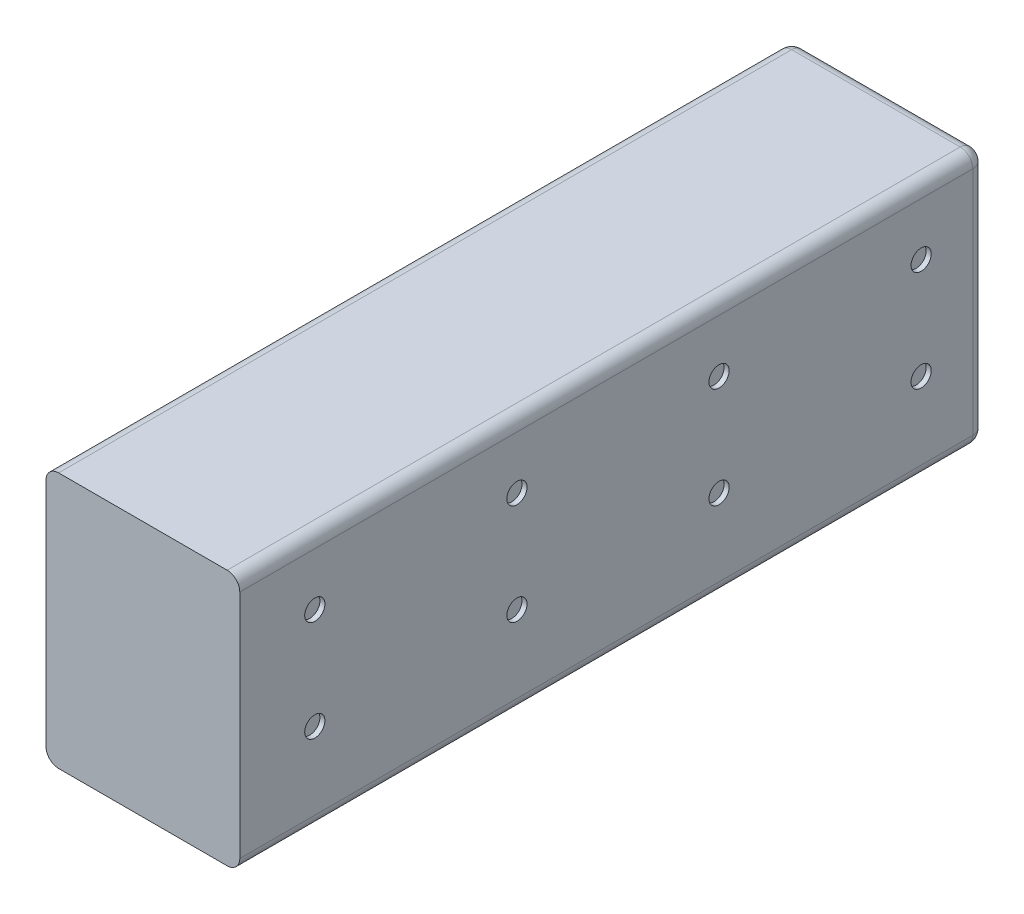
ISO-10303-21;
HEADER;
FILE_DESCRIPTION(('STEP AP214'),'2;1');
FILE_NAME('part.step','',(''),(''),'','','');
FILE_SCHEMA(('AUTOMOTIVE_DESIGN { 1 0 10303 214 1 1 1 1 }'));
ENDSEC;
DATA;
#1=APPLICATION_CONTEXT('core data for automotive mechanical design processes');
#2=APPLICATION_PROTOCOL_DEFINITION('international standard','automotive_design',2000,#1);
#3=PRODUCT_CONTEXT('',#1,'mechanical');
#4=PRODUCT('Part','Part','',(#3));
#5=PRODUCT_RELATED_PRODUCT_CATEGORY('part','',(#4));
#6=PRODUCT_DEFINITION_FORMATION('','',#4);
#7=PRODUCT_DEFINITION_CONTEXT('part definition',#1,'design');
#8=PRODUCT_DEFINITION('design','',#6,#7);
#9=PRODUCT_DEFINITION_SHAPE('','',#8);
#10=(LENGTH_UNIT() NAMED_UNIT(*) SI_UNIT(.MILLI.,.METRE.));
#11=(NAMED_UNIT(*) PLANE_ANGLE_UNIT() SI_UNIT($,.RADIAN.));
#12=(NAMED_UNIT(*) SI_UNIT($,.STERADIAN.) SOLID_ANGLE_UNIT());
#13=UNCERTAINTY_MEASURE_WITH_UNIT(LENGTH_MEASURE(1.E-05),#10,'distance_accuracy_value','');
#14=(GEOMETRIC_REPRESENTATION_CONTEXT(3) GLOBAL_UNCERTAINTY_ASSIGNED_CONTEXT((#13)) GLOBAL_UNIT_ASSIGNED_CONTEXT((#10,
#11,#12)) REPRESENTATION_CONTEXT('',''));
#15=CARTESIAN_POINT('',(0.,0.,0.));
#16=DIRECTION('',(0.,0.,1.));
#17=DIRECTION('',(1.,0.,0.));
#18=AXIS2_PLACEMENT_3D('',#15,#16,#17);
#19=CARTESIAN_POINT('',(0.,0.,295.148));
#20=DIRECTION('',(1.,0.,0.));
#21=DIRECTION('',(0.,0.,-1.));
#22=AXIS2_PLACEMENT_3D('',#19,#20,#21);
#23=PLANE('',#22);
#24=CARTESIAN_POINT('',(0.,35.4507659315116,185.445597479447));
#25=DIRECTION('',(1.,0.,0.));
#26=DIRECTION('',(0.,0.,-1.));
#27=AXIS2_PLACEMENT_3D('',#24,#25,#26);
#28=CIRCLE('',#27,3.99999999999999);
#29=CARTESIAN_POINT('',(0.,35.4507659315116,181.445597479447));
#30=VERTEX_POINT('',#29);
#31=EDGE_CURVE('E269',#30,#30,#28,.T.);
#32=ORIENTED_EDGE('',*,*,#31,.T.);
#33=EDGE_LOOP('',(#32));
#34=FACE_BOUND('',#33,.T.);
#35=CARTESIAN_POINT('',(0.,75.4507659315116,25.4455974794472));
#36=DIRECTION('',(1.,0.,0.));
#37=DIRECTION('',(0.,0.,-1.));
#38=AXIS2_PLACEMENT_3D('',#35,#36,#37);
#39=CIRCLE('',#38,3.99999999999999);
#40=CARTESIAN_POINT('',(0.,75.4507659315116,21.4455974794472));
#41=VERTEX_POINT('',#40);
#42=EDGE_CURVE('E261',#41,#41,#39,.T.);
#43=ORIENTED_EDGE('',*,*,#42,.T.);
#44=EDGE_LOOP('',(#43));
#45=FACE_BOUND('',#44,.T.);
#46=CARTESIAN_POINT('',(0.,75.4507659315116,105.445597479447));
#47=DIRECTION('',(1.,0.,0.));
#48=DIRECTION('',(0.,0.,-1.));
#49=AXIS2_PLACEMENT_3D('',#46,#47,#48);
#50=CIRCLE('',#49,3.99999999999999);
#51=CARTESIAN_POINT('',(0.,75.4507659315116,101.445597479447));
#52=VERTEX_POINT('',#51);
#53=EDGE_CURVE('E260',#52,#52,#50,.T.);
#54=ORIENTED_EDGE('',*,*,#53,.T.);
#55=EDGE_LOOP('',(#54));
#56=FACE_BOUND('',#55,.T.);
#57=CARTESIAN_POINT('',(0.,75.4507659315116,185.445597479447));
#58=DIRECTION('',(1.,0.,0.));
#59=DIRECTION('',(0.,0.,-1.));
#60=AXIS2_PLACEMENT_3D('',#57,#58,#59);
#61=CIRCLE('',#60,3.99999999999999);
#62=CARTESIAN_POINT('',(0.,75.4507659315116,181.445597479447));
#63=VERTEX_POINT('',#62);
#64=EDGE_CURVE('E279',#63,#63,#61,.T.);
#65=ORIENTED_EDGE('',*,*,#64,.T.);
#66=EDGE_LOOP('',(#65));
#67=FACE_BOUND('',#66,.T.);
#68=CARTESIAN_POINT('',(0.,35.4507659315116,105.445597479447));
#69=DIRECTION('',(1.,0.,0.));
#70=DIRECTION('',(0.,0.,-1.));
#71=AXIS2_PLACEMENT_3D('',#68,#69,#70);
#72=CIRCLE('',#71,3.99999999999999);
#73=CARTESIAN_POINT('',(0.,35.4507659315116,101.445597479447));
#74=VERTEX_POINT('',#73);
#75=EDGE_CURVE('E931',#74,#74,#72,.T.);
#76=ORIENTED_EDGE('',*,*,#75,.T.);
#77=EDGE_LOOP('',(#76));
#78=FACE_BOUND('',#77,.T.);
#79=CARTESIAN_POINT('',(0.,35.4507659315116,25.4455974794468));
#80=DIRECTION('',(1.,0.,0.));
#81=DIRECTION('',(0.,0.,-1.));
#82=AXIS2_PLACEMENT_3D('',#79,#80,#81);
#83=CIRCLE('',#82,3.99999999999999);
#84=CARTESIAN_POINT('',(0.,35.4507659315116,21.4455974794468));
#85=VERTEX_POINT('',#84);
#86=EDGE_CURVE('E252',#85,#85,#83,.T.);
#87=ORIENTED_EDGE('',*,*,#86,.T.);
#88=EDGE_LOOP('',(#87));
#89=FACE_BOUND('',#88,.T.);
#90=CARTESIAN_POINT('',(0.,35.4507659315116,265.445597479447));
#91=DIRECTION('',(1.,0.,0.));
#92=DIRECTION('',(0.,0.,-1.));
#93=AXIS2_PLACEMENT_3D('',#90,#91,#92);
#94=CIRCLE('',#93,3.99999999999999);
#95=CARTESIAN_POINT('',(0.,35.4507659315116,261.445597479447));
#96=VERTEX_POINT('',#95);
#97=EDGE_CURVE('E242',#96,#96,#94,.T.);
#98=ORIENTED_EDGE('',*,*,#97,.T.);
#99=EDGE_LOOP('',(#98));
#100=FACE_BOUND('',#99,.T.);
#101=CARTESIAN_POINT('',(0.,75.4507659315116,265.445597479447));
#102=DIRECTION('',(1.,0.,0.));
#103=DIRECTION('',(0.,0.,-1.));
#104=AXIS2_PLACEMENT_3D('',#101,#102,#103);
#105=CIRCLE('',#104,3.99999999999999);
#106=CARTESIAN_POINT('',(0.,75.4507659315116,261.445597479447));
#107=VERTEX_POINT('',#106);
#108=EDGE_CURVE('E278',#107,#107,#105,.T.);
#109=ORIENTED_EDGE('',*,*,#108,.T.);
#110=EDGE_LOOP('',(#109));
#111=FACE_BOUND('',#110,.T.);
#112=DIRECTION('',(0.,0.,-1.));
#113=VECTOR('',#112,1.);
#114=CARTESIAN_POINT('',(0.,96.346,295.148));
#115=LINE('',#114,#113);
#116=CARTESIAN_POINT('',(0.,96.346,295.148));
#117=VERTEX_POINT('',#116);
#118=CARTESIAN_POINT('',(0.,96.346,5.));
#119=VERTEX_POINT('',#118);
#120=EDGE_CURVE('E150',#117,#119,#115,.T.);
#121=ORIENTED_EDGE('',*,*,#120,.T.);
#122=DIRECTION('',(0.,-1.,0.));
#123=VECTOR('',#122,1.);
#124=CARTESIAN_POINT('',(0.,5.,5.));
#125=LINE('',#124,#123);
#126=CARTESIAN_POINT('',(0.,5.,5.));
#127=VERTEX_POINT('',#126);
#128=EDGE_CURVE('E50',#119,#127,#125,.T.);
#129=ORIENTED_EDGE('',*,*,#128,.T.);
#130=DIRECTION('',(0.,0.,-1.));
#131=VECTOR('',#130,1.);
#132=CARTESIAN_POINT('',(0.,5.,295.148));
#133=LINE('',#132,#131);
#134=CARTESIAN_POINT('',(0.,5.,295.148));
#135=VERTEX_POINT('',#134);
#136=EDGE_CURVE('E155',#127,#135,#133,.F.);
#137=ORIENTED_EDGE('',*,*,#136,.T.);
#138=DIRECTION('',(0.,-1.,0.));
#139=VECTOR('',#138,1.);
#140=CARTESIAN_POINT('',(0.,0.,295.148));
#141=LINE('',#140,#139);
#142=EDGE_CURVE('E128',#117,#135,#141,.T.);
#143=ORIENTED_EDGE('',*,*,#142,.F.);
#144=EDGE_LOOP('',(#121,#129,#137,#143));
#145=FACE_BOUND('',#144,.T.);
#146=ADVANCED_FACE('F40',(#34,#45,#56,#67,#78,#89,#100,#111,#145),#23,.F.);
#147=CARTESIAN_POINT('',(0.,0.,295.148));
#148=DIRECTION('',(0.,1.,0.));
#149=DIRECTION('',(0.,0.,1.));
#150=AXIS2_PLACEMENT_3D('',#147,#148,#149);
#151=PLANE('',#150);
#152=DIRECTION('',(0.,0.,-1.));
#153=VECTOR('',#152,1.);
#154=CARTESIAN_POINT('',(5.,0.,295.148));
#155=LINE('',#154,#153);
#156=CARTESIAN_POINT('',(5.,0.,295.148));
#157=VERTEX_POINT('',#156);
#158=CARTESIAN_POINT('',(5.,0.,5.));
#159=VERTEX_POINT('',#158);
#160=EDGE_CURVE('E139',#157,#159,#155,.T.);
#161=ORIENTED_EDGE('',*,*,#160,.T.);
#162=DIRECTION('',(1.,0.,0.));
#163=VECTOR('',#162,1.);
#164=CARTESIAN_POINT('',(71.708,0.,5.));
#165=LINE('',#164,#163);
#166=CARTESIAN_POINT('',(71.708,0.,5.));
#167=VERTEX_POINT('',#166);
#168=EDGE_CURVE('E196',#159,#167,#165,.T.);
#169=ORIENTED_EDGE('',*,*,#168,.T.);
#170=DIRECTION('',(0.,0.,-1.));
#171=VECTOR('',#170,1.);
#172=CARTESIAN_POINT('',(71.708,0.,295.148));
#173=LINE('',#172,#171);
#174=CARTESIAN_POINT('',(71.708,0.,295.148));
#175=VERTEX_POINT('',#174);
#176=EDGE_CURVE('E142',#167,#175,#173,.F.);
#177=ORIENTED_EDGE('',*,*,#176,.T.);
#178=DIRECTION('',(1.,0.,0.));
#179=VECTOR('',#178,1.);
#180=CARTESIAN_POINT('',(0.,0.,295.148));
#181=LINE('',#180,#179);
#182=EDGE_CURVE('E125',#157,#175,#181,.T.);
#183=ORIENTED_EDGE('',*,*,#182,.F.);
#184=EDGE_LOOP('',(#161,#169,#177,#183));
#185=FACE_BOUND('',#184,.T.);
#186=ADVANCED_FACE('F138',(#185),#151,.F.);
#187=CARTESIAN_POINT('',(76.708,0.,295.148));
#188=DIRECTION('',(-1.,0.,0.));
#189=DIRECTION('',(0.,0.,1.));
#190=AXIS2_PLACEMENT_3D('',#187,#188,#189);
#191=PLANE('',#190);
#192=CARTESIAN_POINT('',(76.708,35.4507659315116,185.445597479447));
#193=DIRECTION('',(1.,0.,0.));
#194=DIRECTION('',(0.,0.,-1.));
#195=AXIS2_PLACEMENT_3D('',#192,#193,#194);
#196=CIRCLE('',#195,3.99999999999999);
#197=CARTESIAN_POINT('',(76.708,35.4507659315116,181.445597479447));
#198=VERTEX_POINT('',#197);
#199=EDGE_CURVE('E302',#198,#198,#196,.T.);
#200=ORIENTED_EDGE('',*,*,#199,.F.);
#201=EDGE_LOOP('',(#200));
#202=FACE_BOUND('',#201,.T.);
#203=CARTESIAN_POINT('',(76.708,75.4507659315116,25.4455974794472));
#204=DIRECTION('',(1.,0.,0.));
#205=DIRECTION('',(0.,0.,-1.));
#206=AXIS2_PLACEMENT_3D('',#203,#204,#205);
#207=CIRCLE('',#206,3.99999999999999);
#208=CARTESIAN_POINT('',(76.708,75.4507659315116,21.4455974794472));
#209=VERTEX_POINT('',#208);
#210=EDGE_CURVE('E327',#209,#209,#207,.T.);
#211=ORIENTED_EDGE('',*,*,#210,.F.);
#212=EDGE_LOOP('',(#211));
#213=FACE_BOUND('',#212,.T.);
#214=CARTESIAN_POINT('',(76.708,75.4507659315116,105.445597479447));
#215=DIRECTION('',(1.,0.,0.));
#216=DIRECTION('',(0.,0.,-1.));
#217=AXIS2_PLACEMENT_3D('',#214,#215,#216);
#218=CIRCLE('',#217,3.99999999999999);
#219=CARTESIAN_POINT('',(76.708,75.4507659315116,101.445597479447));
#220=VERTEX_POINT('',#219);
#221=EDGE_CURVE('E326',#220,#220,#218,.T.);
#222=ORIENTED_EDGE('',*,*,#221,.F.);
#223=EDGE_LOOP('',(#222));
#224=FACE_BOUND('',#223,.T.);
#225=CARTESIAN_POINT('',(76.708,75.4507659315116,185.445597479447));
#226=DIRECTION('',(1.,0.,0.));
#227=DIRECTION('',(0.,0.,-1.));
#228=AXIS2_PLACEMENT_3D('',#225,#226,#227);
#229=CIRCLE('',#228,3.99999999999999);
#230=CARTESIAN_POINT('',(76.708,75.4507659315116,181.445597479447));
#231=VERTEX_POINT('',#230);
#232=EDGE_CURVE('E343',#231,#231,#229,.T.);
#233=ORIENTED_EDGE('',*,*,#232,.F.);
#234=EDGE_LOOP('',(#233));
#235=FACE_BOUND('',#234,.T.);
#236=CARTESIAN_POINT('',(76.708,35.4507659315116,105.445597479447));
#237=DIRECTION('',(1.,0.,0.));
#238=DIRECTION('',(0.,0.,-1.));
#239=AXIS2_PLACEMENT_3D('',#236,#237,#238);
#240=CIRCLE('',#239,3.99999999999999);
#241=CARTESIAN_POINT('',(76.708,35.4507659315116,101.445597479447));
#242=VERTEX_POINT('',#241);
#243=EDGE_CURVE('E303',#242,#242,#240,.T.);
#244=ORIENTED_EDGE('',*,*,#243,.F.);
#245=EDGE_LOOP('',(#244));
#246=FACE_BOUND('',#245,.T.);
#247=CARTESIAN_POINT('',(76.708,35.4507659315116,25.4455974794468));
#248=DIRECTION('',(1.,0.,0.));
#249=DIRECTION('',(0.,0.,-1.));
#250=AXIS2_PLACEMENT_3D('',#247,#248,#249);
#251=CIRCLE('',#250,3.99999999999999);
#252=CARTESIAN_POINT('',(76.708,35.4507659315116,21.4455974794468));
#253=VERTEX_POINT('',#252);
#254=EDGE_CURVE('E311',#253,#253,#251,.T.);
#255=ORIENTED_EDGE('',*,*,#254,.F.);
#256=EDGE_LOOP('',(#255));
#257=FACE_BOUND('',#256,.T.);
#258=CARTESIAN_POINT('',(76.708,35.4507659315116,265.445597479447));
#259=DIRECTION('',(1.,0.,0.));
#260=DIRECTION('',(0.,0.,-1.));
#261=AXIS2_PLACEMENT_3D('',#258,#259,#260);
#262=CIRCLE('',#261,3.99999999999999);
#263=CARTESIAN_POINT('',(76.708,35.4507659315116,261.445597479447));
#264=VERTEX_POINT('',#263);
#265=EDGE_CURVE('E294',#264,#264,#262,.T.);
#266=ORIENTED_EDGE('',*,*,#265,.F.);
#267=EDGE_LOOP('',(#266));
#268=FACE_BOUND('',#267,.T.);
#269=CARTESIAN_POINT('',(76.708,75.4507659315116,265.445597479447));
#270=DIRECTION('',(1.,0.,0.));
#271=DIRECTION('',(0.,0.,-1.));
#272=AXIS2_PLACEMENT_3D('',#269,#270,#271);
#273=CIRCLE('',#272,3.99999999999999);
#274=CARTESIAN_POINT('',(76.708,75.4507659315116,261.445597479447));
#275=VERTEX_POINT('',#274);
#276=EDGE_CURVE('E342',#275,#275,#273,.T.);
#277=ORIENTED_EDGE('',*,*,#276,.F.);
#278=EDGE_LOOP('',(#277));
#279=FACE_BOUND('',#278,.T.);
#280=DIRECTION('',(0.,0.,-1.));
#281=VECTOR('',#280,1.);
#282=CARTESIAN_POINT('',(76.708,5.,295.148));
#283=LINE('',#282,#281);
#284=CARTESIAN_POINT('',(76.708,5.,295.148));
#285=VERTEX_POINT('',#284);
#286=CARTESIAN_POINT('',(76.708,5.,5.));
#287=VERTEX_POINT('',#286);
#288=EDGE_CURVE('E173',#285,#287,#283,.T.);
#289=ORIENTED_EDGE('',*,*,#288,.T.);
#290=DIRECTION('',(0.,1.,0.));
#291=VECTOR('',#290,1.);
#292=CARTESIAN_POINT('',(76.708,96.346,5.));
#293=LINE('',#292,#291);
#294=CARTESIAN_POINT('',(76.708,96.346,5.));
#295=VERTEX_POINT('',#294);
#296=EDGE_CURVE('E209',#287,#295,#293,.T.);
#297=ORIENTED_EDGE('',*,*,#296,.T.);
#298=DIRECTION('',(0.,0.,-1.));
#299=VECTOR('',#298,1.);
#300=CARTESIAN_POINT('',(76.708,96.346,295.148));
#301=LINE('',#300,#299);
#302=CARTESIAN_POINT('',(76.708,96.346,295.148));
#303=VERTEX_POINT('',#302);
#304=EDGE_CURVE('E133',#295,#303,#301,.F.);
#305=ORIENTED_EDGE('',*,*,#304,.T.);
#306=DIRECTION('',(0.,1.,0.));
#307=VECTOR('',#306,1.);
#308=CARTESIAN_POINT('',(76.708,0.,295.148));
#309=LINE('',#308,#307);
#310=EDGE_CURVE('E144',#285,#303,#309,.T.);
#311=ORIENTED_EDGE('',*,*,#310,.F.);
#312=EDGE_LOOP('',(#289,#297,#305,#311));
#313=FACE_BOUND('',#312,.T.);
#314=ADVANCED_FACE('F403',(#202,#213,#224,#235,#246,#257,#268,#279,#313),#191,.F.);
#315=CARTESIAN_POINT('',(0.,101.346,295.148));
#316=DIRECTION('',(0.,-1.,0.));
#317=DIRECTION('',(0.,0.,-1.));
#318=AXIS2_PLACEMENT_3D('',#315,#316,#317);
#319=PLANE('',#318);
#320=DIRECTION('',(0.,0.,-1.));
#321=VECTOR('',#320,1.);
#322=CARTESIAN_POINT('',(71.708,101.346,295.148));
#323=LINE('',#322,#321);
#324=CARTESIAN_POINT('',(71.708,101.346,295.148));
#325=VERTEX_POINT('',#324);
#326=CARTESIAN_POINT('',(71.708,101.346,5.));
#327=VERTEX_POINT('',#326);
#328=EDGE_CURVE('E180',#325,#327,#323,.T.);
#329=ORIENTED_EDGE('',*,*,#328,.T.);
#330=DIRECTION('',(-1.,0.,0.));
#331=VECTOR('',#330,1.);
#332=CARTESIAN_POINT('',(5.,101.346,5.));
#333=LINE('',#332,#331);
#334=CARTESIAN_POINT('',(5.,101.346,5.));
#335=VERTEX_POINT('',#334);
#336=EDGE_CURVE('E11',#327,#335,#333,.T.);
#337=ORIENTED_EDGE('',*,*,#336,.T.);
#338=DIRECTION('',(0.,0.,-1.));
#339=VECTOR('',#338,1.);
#340=CARTESIAN_POINT('',(5.,101.346,295.148));
#341=LINE('',#340,#339);
#342=CARTESIAN_POINT('',(5.,101.346,295.148));
#343=VERTEX_POINT('',#342);
#344=EDGE_CURVE('E177',#335,#343,#341,.F.);
#345=ORIENTED_EDGE('',*,*,#344,.T.);
#346=DIRECTION('',(-1.,0.,0.));
#347=VECTOR('',#346,1.);
#348=CARTESIAN_POINT('',(0.,101.346,295.148));
#349=LINE('',#348,#347);
#350=EDGE_CURVE('E157',#325,#343,#349,.T.);
#351=ORIENTED_EDGE('',*,*,#350,.F.);
#352=EDGE_LOOP('',(#329,#337,#345,#351));
#353=FACE_BOUND('',#352,.T.);
#354=ADVANCED_FACE('F410',(#353),#319,.F.);
#355=CARTESIAN_POINT('',(0.,0.,295.148));
#356=DIRECTION('',(0.,0.,-1.));
#357=DIRECTION('',(-1.,0.,0.));
#358=AXIS2_PLACEMENT_3D('',#355,#356,#357);
#359=PLANE('',#358);
#360=ORIENTED_EDGE('',*,*,#142,.T.);
#361=CARTESIAN_POINT('',(5.,5.,295.148));
#362=DIRECTION('',(0.,0.,-1.));
#363=DIRECTION('',(-1.,0.,0.));
#364=AXIS2_PLACEMENT_3D('',#361,#362,#363);
#365=CIRCLE('',#364,5.);
#366=EDGE_CURVE('E122',#135,#157,#365,.F.);
#367=ORIENTED_EDGE('',*,*,#366,.T.);
#368=ORIENTED_EDGE('',*,*,#182,.T.);
#369=CARTESIAN_POINT('',(71.708,5.,295.148));
#370=DIRECTION('',(0.,0.,-1.));
#371=DIRECTION('',(-1.,0.,0.));
#372=AXIS2_PLACEMENT_3D('',#369,#370,#371);
#373=CIRCLE('',#372,5.);
#374=EDGE_CURVE('E134',#175,#285,#373,.F.);
#375=ORIENTED_EDGE('',*,*,#374,.T.);
#376=ORIENTED_EDGE('',*,*,#310,.T.);
#377=CARTESIAN_POINT('',(71.708,96.346,295.148));
#378=DIRECTION('',(0.,0.,-1.));
#379=DIRECTION('',(-1.,0.,0.));
#380=AXIS2_PLACEMENT_3D('',#377,#378,#379);
#381=CIRCLE('',#380,5.);
#382=EDGE_CURVE('E166',#303,#325,#381,.F.);
#383=ORIENTED_EDGE('',*,*,#382,.T.);
#384=ORIENTED_EDGE('',*,*,#350,.T.);
#385=CARTESIAN_POINT('',(5.,96.346,295.148));
#386=DIRECTION('',(0.,0.,-1.));
#387=DIRECTION('',(-1.,0.,0.));
#388=AXIS2_PLACEMENT_3D('',#385,#386,#387);
#389=CIRCLE('',#388,5.);
#390=EDGE_CURVE('E163',#343,#117,#389,.F.);
#391=ORIENTED_EDGE('',*,*,#390,.T.);
#392=EDGE_LOOP('',(#360,#367,#368,#375,#376,#383,#384,#391));
#393=FACE_BOUND('',#392,.T.);
#394=ADVANCED_FACE('F124',(#393),#359,.F.);
#395=CARTESIAN_POINT('',(0.,0.,0.));
#396=DIRECTION('',(0.,0.,-1.));
#397=DIRECTION('',(-1.,0.,0.));
#398=AXIS2_PLACEMENT_3D('',#395,#396,#397);
#399=PLANE('',#398);
#400=DIRECTION('',(0.,1.,0.));
#401=VECTOR('',#400,1.);
#402=CARTESIAN_POINT('',(71.708,5.,0.));
#403=LINE('',#402,#401);
#404=CARTESIAN_POINT('',(71.708,96.346,0.));
#405=VERTEX_POINT('',#404);
#406=CARTESIAN_POINT('',(71.708,5.,0.));
#407=VERTEX_POINT('',#406);
#408=EDGE_CURVE('E58',#405,#407,#403,.F.);
#409=ORIENTED_EDGE('',*,*,#408,.T.);
#410=DIRECTION('',(1.,0.,0.));
#411=VECTOR('',#410,1.);
#412=CARTESIAN_POINT('',(5.,5.,0.));
#413=LINE('',#412,#411);
#414=CARTESIAN_POINT('',(5.,5.,0.));
#415=VERTEX_POINT('',#414);
#416=EDGE_CURVE('E206',#407,#415,#413,.F.);
#417=ORIENTED_EDGE('',*,*,#416,.T.);
#418=DIRECTION('',(0.,-1.,0.));
#419=VECTOR('',#418,1.);
#420=CARTESIAN_POINT('',(5.,96.346,0.));
#421=LINE('',#420,#419);
#422=CARTESIAN_POINT('',(5.,96.346,0.));
#423=VERTEX_POINT('',#422);
#424=EDGE_CURVE('E66',#415,#423,#421,.F.);
#425=ORIENTED_EDGE('',*,*,#424,.T.);
#426=DIRECTION('',(-1.,0.,0.));
#427=VECTOR('',#426,1.);
#428=CARTESIAN_POINT('',(71.708,96.346,0.));
#429=LINE('',#428,#427);
#430=EDGE_CURVE('E199',#423,#405,#429,.F.);
#431=ORIENTED_EDGE('',*,*,#430,.T.);
#432=EDGE_LOOP('',(#409,#417,#425,#431));
#433=FACE_BOUND('',#432,.T.);
#434=ADVANCED_FACE('F387',(#433),#399,.T.);
#435=CARTESIAN_POINT('',(74.708,75.4507659315116,265.445597479447));
#436=DIRECTION('',(1.,0.,0.));
#437=DIRECTION('',(0.,0.,-1.));
#438=AXIS2_PLACEMENT_3D('',#435,#436,#437);
#439=CYLINDRICAL_SURFACE('',#438,3.99999999999999);
#440=CARTESIAN_POINT('',(74.708,75.4507659315116,265.445597479447));
#441=DIRECTION('',(1.,0.,0.));
#442=DIRECTION('',(0.,0.,-1.));
#443=AXIS2_PLACEMENT_3D('',#440,#441,#442);
#444=CIRCLE('',#443,3.99999999999999);
#445=CARTESIAN_POINT('',(74.708,75.4507659315116,261.445597479447));
#446=VERTEX_POINT('',#445);
#447=EDGE_CURVE('E354',#446,#446,#444,.T.);
#448=ORIENTED_EDGE('',*,*,#447,.F.);
#449=EDGE_LOOP('',(#448));
#450=FACE_BOUND('',#449,.T.);
#451=ORIENTED_EDGE('',*,*,#276,.T.);
#452=EDGE_LOOP('',(#451));
#453=FACE_BOUND('',#452,.T.);
#454=ADVANCED_FACE('F720',(#450,#453),#439,.F.);
#455=CARTESIAN_POINT('',(74.708,75.4507659315116,265.445597479447));
#456=DIRECTION('',(1.,0.,0.));
#457=DIRECTION('',(0.,0.,-1.));
#458=AXIS2_PLACEMENT_3D('',#455,#456,#457);
#459=PLANE('',#458);
#460=ORIENTED_EDGE('',*,*,#447,.T.);
#461=EDGE_LOOP('',(#460));
#462=FACE_BOUND('',#461,.T.);
#463=ADVANCED_FACE('F712',(#462),#459,.T.);
#464=CARTESIAN_POINT('',(74.708,35.4507659315116,265.445597479447));
#465=DIRECTION('',(1.,0.,0.));
#466=DIRECTION('',(0.,0.,-1.));
#467=AXIS2_PLACEMENT_3D('',#464,#465,#466);
#468=CYLINDRICAL_SURFACE('',#467,3.99999999999999);
#469=CARTESIAN_POINT('',(74.708,35.4507659315116,265.445597479447));
#470=DIRECTION('',(1.,0.,0.));
#471=DIRECTION('',(0.,0.,-1.));
#472=AXIS2_PLACEMENT_3D('',#469,#470,#471);
#473=CIRCLE('',#472,3.99999999999999);
#474=CARTESIAN_POINT('',(74.708,35.4507659315116,261.445597479447));
#475=VERTEX_POINT('',#474);
#476=EDGE_CURVE('E315',#475,#475,#473,.T.);
#477=ORIENTED_EDGE('',*,*,#476,.F.);
#478=EDGE_LOOP('',(#477));
#479=FACE_BOUND('',#478,.T.);
#480=ORIENTED_EDGE('',*,*,#265,.T.);
#481=EDGE_LOOP('',(#480));
#482=FACE_BOUND('',#481,.T.);
#483=ADVANCED_FACE('F704',(#479,#482),#468,.F.);
#484=CARTESIAN_POINT('',(74.708,35.4507659315116,265.445597479447));
#485=DIRECTION('',(1.,0.,0.));
#486=DIRECTION('',(0.,0.,-1.));
#487=AXIS2_PLACEMENT_3D('',#484,#485,#486);
#488=PLANE('',#487);
#489=ORIENTED_EDGE('',*,*,#476,.T.);
#490=EDGE_LOOP('',(#489));
#491=FACE_BOUND('',#490,.T.);
#492=ADVANCED_FACE('F696',(#491),#488,.T.);
#493=CARTESIAN_POINT('',(74.708,35.4507659315116,25.4455974794468));
#494=DIRECTION('',(1.,0.,0.));
#495=DIRECTION('',(0.,0.,-1.));
#496=AXIS2_PLACEMENT_3D('',#493,#494,#495);
#497=CYLINDRICAL_SURFACE('',#496,3.99999999999999);
#498=CARTESIAN_POINT('',(74.708,35.4507659315116,25.4455974794468));
#499=DIRECTION('',(1.,0.,0.));
#500=DIRECTION('',(0.,0.,-1.));
#501=AXIS2_PLACEMENT_3D('',#498,#499,#500);
#502=CIRCLE('',#501,3.99999999999999);
#503=CARTESIAN_POINT('',(74.708,35.4507659315116,21.4455974794468));
#504=VERTEX_POINT('',#503);
#505=EDGE_CURVE('E307',#504,#504,#502,.T.);
#506=ORIENTED_EDGE('',*,*,#505,.F.);
#507=EDGE_LOOP('',(#506));
#508=FACE_BOUND('',#507,.T.);
#509=ORIENTED_EDGE('',*,*,#254,.T.);
#510=EDGE_LOOP('',(#509));
#511=FACE_BOUND('',#510,.T.);
#512=ADVANCED_FACE('F688',(#508,#511),#497,.F.);
#513=CARTESIAN_POINT('',(74.708,35.4507659315116,25.4455974794468));
#514=DIRECTION('',(1.,0.,0.));
#515=DIRECTION('',(0.,0.,-1.));
#516=AXIS2_PLACEMENT_3D('',#513,#514,#515);
#517=PLANE('',#516);
#518=ORIENTED_EDGE('',*,*,#505,.T.);
#519=EDGE_LOOP('',(#518));
#520=FACE_BOUND('',#519,.T.);
#521=ADVANCED_FACE('F680',(#520),#517,.T.);
#522=CARTESIAN_POINT('',(74.708,35.4507659315116,105.445597479447));
#523=DIRECTION('',(1.,0.,0.));
#524=DIRECTION('',(0.,0.,-1.));
#525=AXIS2_PLACEMENT_3D('',#522,#523,#524);
#526=CYLINDRICAL_SURFACE('',#525,3.99999999999999);
#527=CARTESIAN_POINT('',(74.708,35.4507659315116,105.445597479447));
#528=DIRECTION('',(1.,0.,0.));
#529=DIRECTION('',(0.,0.,-1.));
#530=AXIS2_PLACEMENT_3D('',#527,#528,#529);
#531=CIRCLE('',#530,3.99999999999999);
#532=CARTESIAN_POINT('',(74.708,35.4507659315116,101.445597479447));
#533=VERTEX_POINT('',#532);
#534=EDGE_CURVE('E298',#533,#533,#531,.T.);
#535=ORIENTED_EDGE('',*,*,#534,.F.);
#536=EDGE_LOOP('',(#535));
#537=FACE_BOUND('',#536,.T.);
#538=ORIENTED_EDGE('',*,*,#243,.T.);
#539=EDGE_LOOP('',(#538));
#540=FACE_BOUND('',#539,.T.);
#541=ADVANCED_FACE('F672',(#537,#540),#526,.F.);
#542=CARTESIAN_POINT('',(74.708,35.4507659315116,105.445597479447));
#543=DIRECTION('',(1.,0.,0.));
#544=DIRECTION('',(0.,0.,-1.));
#545=AXIS2_PLACEMENT_3D('',#542,#543,#544);
#546=PLANE('',#545);
#547=ORIENTED_EDGE('',*,*,#534,.T.);
#548=EDGE_LOOP('',(#547));
#549=FACE_BOUND('',#548,.T.);
#550=ADVANCED_FACE('F664',(#549),#546,.T.);
#551=CARTESIAN_POINT('',(74.708,75.4507659315116,185.445597479447));
#552=DIRECTION('',(1.,0.,0.));
#553=DIRECTION('',(0.,0.,-1.));
#554=AXIS2_PLACEMENT_3D('',#551,#552,#553);
#555=CYLINDRICAL_SURFACE('',#554,3.99999999999999);
#556=CARTESIAN_POINT('',(74.708,75.4507659315116,185.445597479447));
#557=DIRECTION('',(1.,0.,0.));
#558=DIRECTION('',(0.,0.,-1.));
#559=AXIS2_PLACEMENT_3D('',#556,#557,#558);
#560=CIRCLE('',#559,3.99999999999999);
#561=CARTESIAN_POINT('',(74.708,75.4507659315116,181.445597479447));
#562=VERTEX_POINT('',#561);
#563=EDGE_CURVE('E338',#562,#562,#560,.T.);
#564=ORIENTED_EDGE('',*,*,#563,.F.);
#565=EDGE_LOOP('',(#564));
#566=FACE_BOUND('',#565,.T.);
#567=ORIENTED_EDGE('',*,*,#232,.T.);
#568=EDGE_LOOP('',(#567));
#569=FACE_BOUND('',#568,.T.);
#570=ADVANCED_FACE('F656',(#566,#569),#555,.F.);
#571=CARTESIAN_POINT('',(74.708,75.4507659315116,185.445597479447));
#572=DIRECTION('',(1.,0.,0.));
#573=DIRECTION('',(0.,0.,-1.));
#574=AXIS2_PLACEMENT_3D('',#571,#572,#573);
#575=PLANE('',#574);
#576=ORIENTED_EDGE('',*,*,#563,.T.);
#577=EDGE_LOOP('',(#576));
#578=FACE_BOUND('',#577,.T.);
#579=ADVANCED_FACE('F648',(#578),#575,.T.);
#580=CARTESIAN_POINT('',(74.708,75.4507659315116,105.445597479447));
#581=DIRECTION('',(1.,0.,0.));
#582=DIRECTION('',(0.,0.,-1.));
#583=AXIS2_PLACEMENT_3D('',#580,#581,#582);
#584=CYLINDRICAL_SURFACE('',#583,3.99999999999999);
#585=CARTESIAN_POINT('',(74.708,75.4507659315116,105.445597479447));
#586=DIRECTION('',(1.,0.,0.));
#587=DIRECTION('',(0.,0.,-1.));
#588=AXIS2_PLACEMENT_3D('',#585,#586,#587);
#589=CIRCLE('',#588,3.99999999999999);
#590=CARTESIAN_POINT('',(74.708,75.4507659315116,101.445597479447));
#591=VERTEX_POINT('',#590);
#592=EDGE_CURVE('E347',#591,#591,#589,.T.);
#593=ORIENTED_EDGE('',*,*,#592,.F.);
#594=EDGE_LOOP('',(#593));
#595=FACE_BOUND('',#594,.T.);
#596=ORIENTED_EDGE('',*,*,#221,.T.);
#597=EDGE_LOOP('',(#596));
#598=FACE_BOUND('',#597,.T.);
#599=ADVANCED_FACE('F640',(#595,#598),#584,.F.);
#600=CARTESIAN_POINT('',(74.708,75.4507659315116,105.445597479447));
#601=DIRECTION('',(1.,0.,0.));
#602=DIRECTION('',(0.,0.,-1.));
#603=AXIS2_PLACEMENT_3D('',#600,#601,#602);
#604=PLANE('',#603);
#605=ORIENTED_EDGE('',*,*,#592,.T.);
#606=EDGE_LOOP('',(#605));
#607=FACE_BOUND('',#606,.T.);
#608=ADVANCED_FACE('F632',(#607),#604,.T.);
#609=CARTESIAN_POINT('',(74.708,75.4507659315116,25.4455974794472));
#610=DIRECTION('',(1.,0.,0.));
#611=DIRECTION('',(0.,0.,-1.));
#612=AXIS2_PLACEMENT_3D('',#609,#610,#611);
#613=CYLINDRICAL_SURFACE('',#612,3.99999999999999);
#614=CARTESIAN_POINT('',(74.708,75.4507659315116,25.4455974794472));
#615=DIRECTION('',(1.,0.,0.));
#616=DIRECTION('',(0.,0.,-1.));
#617=AXIS2_PLACEMENT_3D('',#614,#615,#616);
#618=CIRCLE('',#617,3.99999999999999);
#619=CARTESIAN_POINT('',(74.708,75.4507659315116,21.4455974794472));
#620=VERTEX_POINT('',#619);
#621=EDGE_CURVE('E322',#620,#620,#618,.T.);
#622=ORIENTED_EDGE('',*,*,#621,.F.);
#623=EDGE_LOOP('',(#622));
#624=FACE_BOUND('',#623,.T.);
#625=ORIENTED_EDGE('',*,*,#210,.T.);
#626=EDGE_LOOP('',(#625));
#627=FACE_BOUND('',#626,.T.);
#628=ADVANCED_FACE('F624',(#624,#627),#613,.F.);
#629=CARTESIAN_POINT('',(74.708,75.4507659315116,25.4455974794472));
#630=DIRECTION('',(1.,0.,0.));
#631=DIRECTION('',(0.,0.,-1.));
#632=AXIS2_PLACEMENT_3D('',#629,#630,#631);
#633=PLANE('',#632);
#634=ORIENTED_EDGE('',*,*,#621,.T.);
#635=EDGE_LOOP('',(#634));
#636=FACE_BOUND('',#635,.T.);
#637=ADVANCED_FACE('F616',(#636),#633,.T.);
#638=CARTESIAN_POINT('',(74.708,35.4507659315116,185.445597479447));
#639=DIRECTION('',(1.,0.,0.));
#640=DIRECTION('',(0.,0.,-1.));
#641=AXIS2_PLACEMENT_3D('',#638,#639,#640);
#642=CYLINDRICAL_SURFACE('',#641,3.99999999999999);
#643=CARTESIAN_POINT('',(74.708,35.4507659315116,185.445597479447));
#644=DIRECTION('',(1.,0.,0.));
#645=DIRECTION('',(0.,0.,-1.));
#646=AXIS2_PLACEMENT_3D('',#643,#644,#645);
#647=CIRCLE('',#646,3.99999999999999);
#648=CARTESIAN_POINT('',(74.708,35.4507659315116,181.445597479447));
#649=VERTEX_POINT('',#648);
#650=EDGE_CURVE('E331',#649,#649,#647,.T.);
#651=ORIENTED_EDGE('',*,*,#650,.F.);
#652=EDGE_LOOP('',(#651));
#653=FACE_BOUND('',#652,.T.);
#654=ORIENTED_EDGE('',*,*,#199,.T.);
#655=EDGE_LOOP('',(#654));
#656=FACE_BOUND('',#655,.T.);
#657=ADVANCED_FACE('F608',(#653,#656),#642,.F.);
#658=CARTESIAN_POINT('',(74.708,35.4507659315116,185.445597479447));
#659=DIRECTION('',(1.,0.,0.));
#660=DIRECTION('',(0.,0.,-1.));
#661=AXIS2_PLACEMENT_3D('',#658,#659,#660);
#662=PLANE('',#661);
#663=ORIENTED_EDGE('',*,*,#650,.T.);
#664=EDGE_LOOP('',(#663));
#665=FACE_BOUND('',#664,.T.);
#666=ADVANCED_FACE('F600',(#665),#662,.T.);
#667=CARTESIAN_POINT('',(2.,75.4507659315116,265.445597479447));
#668=DIRECTION('',(-1.,0.,0.));
#669=DIRECTION('',(0.,0.,1.));
#670=AXIS2_PLACEMENT_3D('',#667,#668,#669);
#671=CYLINDRICAL_SURFACE('',#670,3.99999999999999);
#672=CARTESIAN_POINT('',(2.,75.4507659315116,265.445597479447));
#673=DIRECTION('',(1.,0.,0.));
#674=DIRECTION('',(0.,0.,-1.));
#675=AXIS2_PLACEMENT_3D('',#672,#673,#674);
#676=CIRCLE('',#675,3.99999999999999);
#677=CARTESIAN_POINT('',(2.,75.4507659315116,261.445597479447));
#678=VERTEX_POINT('',#677);
#679=EDGE_CURVE('E290',#678,#678,#676,.T.);
#680=ORIENTED_EDGE('',*,*,#679,.T.);
#681=EDGE_LOOP('',(#680));
#682=FACE_BOUND('',#681,.T.);
#683=ORIENTED_EDGE('',*,*,#108,.F.);
#684=EDGE_LOOP('',(#683));
#685=FACE_BOUND('',#684,.T.);
#686=ADVANCED_FACE('F592',(#682,#685),#671,.F.);
#687=CARTESIAN_POINT('',(2.,75.4507659315116,265.445597479447));
#688=DIRECTION('',(-1.,0.,0.));
#689=DIRECTION('',(0.,0.,-1.));
#690=AXIS2_PLACEMENT_3D('',#687,#688,#689);
#691=PLANE('',#690);
#692=ORIENTED_EDGE('',*,*,#679,.F.);
#693=EDGE_LOOP('',(#692));
#694=FACE_BOUND('',#693,.T.);
#695=ADVANCED_FACE('F584',(#694),#691,.T.);
#696=CARTESIAN_POINT('',(2.,35.4507659315116,265.445597479447));
#697=DIRECTION('',(-1.,0.,0.));
#698=DIRECTION('',(0.,0.,1.));
#699=AXIS2_PLACEMENT_3D('',#696,#697,#698);
#700=CYLINDRICAL_SURFACE('',#699,3.99999999999999);
#701=CARTESIAN_POINT('',(2.,35.4507659315116,265.445597479447));
#702=DIRECTION('',(1.,0.,0.));
#703=DIRECTION('',(0.,0.,-1.));
#704=AXIS2_PLACEMENT_3D('',#701,#702,#703);
#705=CIRCLE('',#704,3.99999999999999);
#706=CARTESIAN_POINT('',(2.,35.4507659315116,261.445597479447));
#707=VERTEX_POINT('',#706);
#708=EDGE_CURVE('E246',#707,#707,#705,.T.);
#709=ORIENTED_EDGE('',*,*,#708,.T.);
#710=EDGE_LOOP('',(#709));
#711=FACE_BOUND('',#710,.T.);
#712=ORIENTED_EDGE('',*,*,#97,.F.);
#713=EDGE_LOOP('',(#712));
#714=FACE_BOUND('',#713,.T.);
#715=ADVANCED_FACE('F576',(#711,#714),#700,.F.);
#716=CARTESIAN_POINT('',(2.,35.4507659315116,265.445597479447));
#717=DIRECTION('',(-1.,0.,0.));
#718=DIRECTION('',(0.,0.,-1.));
#719=AXIS2_PLACEMENT_3D('',#716,#717,#718);
#720=PLANE('',#719);
#721=ORIENTED_EDGE('',*,*,#708,.F.);
#722=EDGE_LOOP('',(#721));
#723=FACE_BOUND('',#722,.T.);
#724=ADVANCED_FACE('F568',(#723),#720,.T.);
#725=CARTESIAN_POINT('',(2.,35.4507659315116,25.4455974794468));
#726=DIRECTION('',(-1.,0.,0.));
#727=DIRECTION('',(0.,0.,1.));
#728=AXIS2_PLACEMENT_3D('',#725,#726,#727);
#729=CYLINDRICAL_SURFACE('',#728,3.99999999999999);
#730=CARTESIAN_POINT('',(2.,35.4507659315116,25.4455974794468));
#731=DIRECTION('',(1.,0.,0.));
#732=DIRECTION('',(0.,0.,-1.));
#733=AXIS2_PLACEMENT_3D('',#730,#731,#732);
#734=CIRCLE('',#733,3.99999999999999);
#735=CARTESIAN_POINT('',(2.,35.4507659315116,21.4455974794468));
#736=VERTEX_POINT('',#735);
#737=EDGE_CURVE('E925',#736,#736,#734,.T.);
#738=ORIENTED_EDGE('',*,*,#737,.T.);
#739=EDGE_LOOP('',(#738));
#740=FACE_BOUND('',#739,.T.);
#741=ORIENTED_EDGE('',*,*,#86,.F.);
#742=EDGE_LOOP('',(#741));
#743=FACE_BOUND('',#742,.T.);
#744=ADVANCED_FACE('F560',(#740,#743),#729,.F.);
#745=CARTESIAN_POINT('',(2.,35.4507659315116,25.4455974794468));
#746=DIRECTION('',(-1.,0.,0.));
#747=DIRECTION('',(0.,0.,-1.));
#748=AXIS2_PLACEMENT_3D('',#745,#746,#747);
#749=PLANE('',#748);
#750=ORIENTED_EDGE('',*,*,#737,.F.);
#751=EDGE_LOOP('',(#750));
#752=FACE_BOUND('',#751,.T.);
#753=ADVANCED_FACE('F552',(#752),#749,.T.);
#754=CARTESIAN_POINT('',(2.,35.4507659315116,105.445597479447));
#755=DIRECTION('',(-1.,0.,0.));
#756=DIRECTION('',(0.,0.,1.));
#757=AXIS2_PLACEMENT_3D('',#754,#755,#756);
#758=CYLINDRICAL_SURFACE('',#757,3.99999999999999);
#759=CARTESIAN_POINT('',(2.,35.4507659315116,105.445597479447));
#760=DIRECTION('',(1.,0.,0.));
#761=DIRECTION('',(0.,0.,-1.));
#762=AXIS2_PLACEMENT_3D('',#759,#760,#761);
#763=CIRCLE('',#762,3.99999999999999);
#764=CARTESIAN_POINT('',(2.,35.4507659315116,101.445597479447));
#765=VERTEX_POINT('',#764);
#766=EDGE_CURVE('E273',#765,#765,#763,.T.);
#767=ORIENTED_EDGE('',*,*,#766,.T.);
#768=EDGE_LOOP('',(#767));
#769=FACE_BOUND('',#768,.T.);
#770=ORIENTED_EDGE('',*,*,#75,.F.);
#771=EDGE_LOOP('',(#770));
#772=FACE_BOUND('',#771,.T.);
#773=ADVANCED_FACE('F544',(#769,#772),#758,.F.);
#774=CARTESIAN_POINT('',(2.,35.4507659315116,105.445597479447));
#775=DIRECTION('',(-1.,0.,0.));
#776=DIRECTION('',(0.,0.,-1.));
#777=AXIS2_PLACEMENT_3D('',#774,#775,#776);
#778=PLANE('',#777);
#779=ORIENTED_EDGE('',*,*,#766,.F.);
#780=EDGE_LOOP('',(#779));
#781=FACE_BOUND('',#780,.T.);
#782=ADVANCED_FACE('F536',(#781),#778,.T.);
#783=CARTESIAN_POINT('',(2.,75.4507659315116,185.445597479447));
#784=DIRECTION('',(-1.,0.,0.));
#785=DIRECTION('',(0.,0.,1.));
#786=AXIS2_PLACEMENT_3D('',#783,#784,#785);
#787=CYLINDRICAL_SURFACE('',#786,3.99999999999999);
#788=CARTESIAN_POINT('',(2.,75.4507659315116,185.445597479447));
#789=DIRECTION('',(1.,0.,0.));
#790=DIRECTION('',(0.,0.,-1.));
#791=AXIS2_PLACEMENT_3D('',#788,#789,#790);
#792=CIRCLE('',#791,3.99999999999999);
#793=CARTESIAN_POINT('',(2.,75.4507659315116,181.445597479447));
#794=VERTEX_POINT('',#793);
#795=EDGE_CURVE('E274',#794,#794,#792,.T.);
#796=ORIENTED_EDGE('',*,*,#795,.T.);
#797=EDGE_LOOP('',(#796));
#798=FACE_BOUND('',#797,.T.);
#799=ORIENTED_EDGE('',*,*,#64,.F.);
#800=EDGE_LOOP('',(#799));
#801=FACE_BOUND('',#800,.T.);
#802=ADVANCED_FACE('F528',(#798,#801),#787,.F.);
#803=CARTESIAN_POINT('',(2.,75.4507659315116,185.445597479447));
#804=DIRECTION('',(-1.,0.,0.));
#805=DIRECTION('',(0.,0.,-1.));
#806=AXIS2_PLACEMENT_3D('',#803,#804,#805);
#807=PLANE('',#806);
#808=ORIENTED_EDGE('',*,*,#795,.F.);
#809=EDGE_LOOP('',(#808));
#810=FACE_BOUND('',#809,.T.);
#811=ADVANCED_FACE('F520',(#810),#807,.T.);
#812=CARTESIAN_POINT('',(2.,75.4507659315116,105.445597479447));
#813=DIRECTION('',(-1.,0.,0.));
#814=DIRECTION('',(0.,0.,1.));
#815=AXIS2_PLACEMENT_3D('',#812,#813,#814);
#816=CYLINDRICAL_SURFACE('',#815,3.99999999999999);
#817=CARTESIAN_POINT('',(2.,75.4507659315116,105.445597479447));
#818=DIRECTION('',(1.,0.,0.));
#819=DIRECTION('',(0.,0.,-1.));
#820=AXIS2_PLACEMENT_3D('',#817,#818,#819);
#821=CIRCLE('',#820,3.99999999999999);
#822=CARTESIAN_POINT('',(2.,75.4507659315116,101.445597479447));
#823=VERTEX_POINT('',#822);
#824=EDGE_CURVE('E283',#823,#823,#821,.T.);
#825=ORIENTED_EDGE('',*,*,#824,.T.);
#826=EDGE_LOOP('',(#825));
#827=FACE_BOUND('',#826,.T.);
#828=ORIENTED_EDGE('',*,*,#53,.F.);
#829=EDGE_LOOP('',(#828));
#830=FACE_BOUND('',#829,.T.);
#831=ADVANCED_FACE('F512',(#827,#830),#816,.F.);
#832=CARTESIAN_POINT('',(2.,75.4507659315116,105.445597479447));
#833=DIRECTION('',(-1.,0.,0.));
#834=DIRECTION('',(0.,0.,-1.));
#835=AXIS2_PLACEMENT_3D('',#832,#833,#834);
#836=PLANE('',#835);
#837=ORIENTED_EDGE('',*,*,#824,.F.);
#838=EDGE_LOOP('',(#837));
#839=FACE_BOUND('',#838,.T.);
#840=ADVANCED_FACE('F504',(#839),#836,.T.);
#841=CARTESIAN_POINT('',(2.,75.4507659315116,25.4455974794472));
#842=DIRECTION('',(-1.,0.,0.));
#843=DIRECTION('',(0.,0.,1.));
#844=AXIS2_PLACEMENT_3D('',#841,#842,#843);
#845=CYLINDRICAL_SURFACE('',#844,3.99999999999999);
#846=CARTESIAN_POINT('',(2.,75.4507659315116,25.4455974794472));
#847=DIRECTION('',(1.,0.,0.));
#848=DIRECTION('',(0.,0.,-1.));
#849=AXIS2_PLACEMENT_3D('',#846,#847,#848);
#850=CIRCLE('',#849,3.99999999999999);
#851=CARTESIAN_POINT('',(2.,75.4507659315116,21.4455974794472));
#852=VERTEX_POINT('',#851);
#853=EDGE_CURVE('E256',#852,#852,#850,.T.);
#854=ORIENTED_EDGE('',*,*,#853,.T.);
#855=EDGE_LOOP('',(#854));
#856=FACE_BOUND('',#855,.T.);
#857=ORIENTED_EDGE('',*,*,#42,.F.);
#858=EDGE_LOOP('',(#857));
#859=FACE_BOUND('',#858,.T.);
#860=ADVANCED_FACE('F496',(#856,#859),#845,.F.);
#861=CARTESIAN_POINT('',(2.,75.4507659315116,25.4455974794472));
#862=DIRECTION('',(-1.,0.,0.));
#863=DIRECTION('',(0.,0.,-1.));
#864=AXIS2_PLACEMENT_3D('',#861,#862,#863);
#865=PLANE('',#864);
#866=ORIENTED_EDGE('',*,*,#853,.F.);
#867=EDGE_LOOP('',(#866));
#868=FACE_BOUND('',#867,.T.);
#869=ADVANCED_FACE('F488',(#868),#865,.T.);
#870=CARTESIAN_POINT('',(2.,35.4507659315116,185.445597479447));
#871=DIRECTION('',(-1.,0.,0.));
#872=DIRECTION('',(0.,0.,1.));
#873=AXIS2_PLACEMENT_3D('',#870,#871,#872);
#874=CYLINDRICAL_SURFACE('',#873,3.99999999999999);
#875=CARTESIAN_POINT('',(2.,35.4507659315116,185.445597479447));
#876=DIRECTION('',(1.,0.,0.));
#877=DIRECTION('',(0.,0.,-1.));
#878=AXIS2_PLACEMENT_3D('',#875,#876,#877);
#879=CIRCLE('',#878,3.99999999999999);
#880=CARTESIAN_POINT('',(2.,35.4507659315116,181.445597479447));
#881=VERTEX_POINT('',#880);
#882=EDGE_CURVE('E265',#881,#881,#879,.T.);
#883=ORIENTED_EDGE('',*,*,#882,.T.);
#884=EDGE_LOOP('',(#883));
#885=FACE_BOUND('',#884,.T.);
#886=ORIENTED_EDGE('',*,*,#31,.F.);
#887=EDGE_LOOP('',(#886));
#888=FACE_BOUND('',#887,.T.);
#889=ADVANCED_FACE('F480',(#885,#888),#874,.F.);
#890=CARTESIAN_POINT('',(2.,35.4507659315116,185.445597479447));
#891=DIRECTION('',(-1.,0.,0.));
#892=DIRECTION('',(0.,0.,-1.));
#893=AXIS2_PLACEMENT_3D('',#890,#891,#892);
#894=PLANE('',#893);
#895=ORIENTED_EDGE('',*,*,#882,.F.);
#896=EDGE_LOOP('',(#895));
#897=FACE_BOUND('',#896,.T.);
#898=ADVANCED_FACE('F433',(#897),#894,.T.);
#899=CARTESIAN_POINT('',(5.,5.,295.148));
#900=DIRECTION('',(0.,0.,-1.));
#901=DIRECTION('',(-1.,0.,0.));
#902=AXIS2_PLACEMENT_3D('',#899,#900,#901);
#903=CYLINDRICAL_SURFACE('',#902,5.);
#904=ORIENTED_EDGE('',*,*,#136,.F.);
#905=CARTESIAN_POINT('',(5.,5.,5.));
#906=DIRECTION('',(0.,0.,-1.));
#907=DIRECTION('',(-1.,0.,0.));
#908=AXIS2_PLACEMENT_3D('',#905,#906,#907);
#909=CIRCLE('',#908,5.);
#910=EDGE_CURVE('E148',#127,#159,#909,.F.);
#911=ORIENTED_EDGE('',*,*,#910,.T.);
#912=ORIENTED_EDGE('',*,*,#160,.F.);
#913=ORIENTED_EDGE('',*,*,#366,.F.);
#914=EDGE_LOOP('',(#904,#911,#912,#913));
#915=FACE_BOUND('',#914,.T.);
#916=ADVANCED_FACE('F146',(#915),#903,.T.);
#917=CARTESIAN_POINT('',(71.708,5.,295.148));
#918=DIRECTION('',(0.,0.,-1.));
#919=DIRECTION('',(-1.,0.,0.));
#920=AXIS2_PLACEMENT_3D('',#917,#918,#919);
#921=CYLINDRICAL_SURFACE('',#920,5.);
#922=ORIENTED_EDGE('',*,*,#176,.F.);
#923=CARTESIAN_POINT('',(71.708,5.,5.));
#924=DIRECTION('',(0.,0.,-1.));
#925=DIRECTION('',(-1.,0.,0.));
#926=AXIS2_PLACEMENT_3D('',#923,#924,#925);
#927=CIRCLE('',#926,5.);
#928=EDGE_CURVE('E188',#167,#287,#927,.F.);
#929=ORIENTED_EDGE('',*,*,#928,.T.);
#930=ORIENTED_EDGE('',*,*,#288,.F.);
#931=ORIENTED_EDGE('',*,*,#374,.F.);
#932=EDGE_LOOP('',(#922,#929,#930,#931));
#933=FACE_BOUND('',#932,.T.);
#934=ADVANCED_FACE('F399',(#933),#921,.T.);
#935=CARTESIAN_POINT('',(71.708,96.346,295.148));
#936=DIRECTION('',(0.,0.,-1.));
#937=DIRECTION('',(-1.,0.,0.));
#938=AXIS2_PLACEMENT_3D('',#935,#936,#937);
#939=CYLINDRICAL_SURFACE('',#938,5.);
#940=ORIENTED_EDGE('',*,*,#304,.F.);
#941=CARTESIAN_POINT('',(71.708,96.346,5.));
#942=DIRECTION('',(0.,0.,-1.));
#943=DIRECTION('',(-1.,0.,0.));
#944=AXIS2_PLACEMENT_3D('',#941,#942,#943);
#945=CIRCLE('',#944,5.);
#946=EDGE_CURVE('E184',#295,#327,#945,.F.);
#947=ORIENTED_EDGE('',*,*,#946,.T.);
#948=ORIENTED_EDGE('',*,*,#328,.F.);
#949=ORIENTED_EDGE('',*,*,#382,.F.);
#950=EDGE_LOOP('',(#940,#947,#948,#949));
#951=FACE_BOUND('',#950,.T.);
#952=ADVANCED_FACE('F407',(#951),#939,.T.);
#953=CARTESIAN_POINT('',(5.,96.346,295.148));
#954=DIRECTION('',(0.,0.,-1.));
#955=DIRECTION('',(-1.,0.,0.));
#956=AXIS2_PLACEMENT_3D('',#953,#954,#955);
#957=CYLINDRICAL_SURFACE('',#956,5.);
#958=ORIENTED_EDGE('',*,*,#344,.F.);
#959=CARTESIAN_POINT('',(5.,96.346,5.));
#960=DIRECTION('',(0.,0.,-1.));
#961=DIRECTION('',(-1.,0.,0.));
#962=AXIS2_PLACEMENT_3D('',#959,#960,#961);
#963=CIRCLE('',#962,5.);
#964=EDGE_CURVE('E193',#335,#119,#963,.F.);
#965=ORIENTED_EDGE('',*,*,#964,.T.);
#966=ORIENTED_EDGE('',*,*,#120,.F.);
#967=ORIENTED_EDGE('',*,*,#390,.F.);
#968=EDGE_LOOP('',(#958,#965,#966,#967));
#969=FACE_BOUND('',#968,.T.);
#970=ADVANCED_FACE('F375',(#969),#957,.T.);
#971=CARTESIAN_POINT('',(5.,5.,5.));
#972=DIRECTION('',(0.,0.,-1.));
#973=DIRECTION('',(-1.,0.,0.));
#974=AXIS2_PLACEMENT_3D('',#971,#972,#973);
#975=SPHERICAL_SURFACE('',#974,5.);
#976=CARTESIAN_POINT('',(5.,5.,5.));
#977=DIRECTION('',(1.,0.,0.));
#978=DIRECTION('',(0.,0.,-1.));
#979=AXIS2_PLACEMENT_3D('',#976,#977,#978);
#980=CIRCLE('',#979,5.);
#981=EDGE_CURVE('E236',#159,#415,#980,.T.);
#982=ORIENTED_EDGE('',*,*,#981,.F.);
#983=ORIENTED_EDGE('',*,*,#910,.F.);
#984=CARTESIAN_POINT('',(5.,5.,5.));
#985=DIRECTION('',(0.,1.,0.));
#986=DIRECTION('',(0.,0.,1.));
#987=AXIS2_PLACEMENT_3D('',#984,#985,#986);
#988=CIRCLE('',#987,5.);
#989=EDGE_CURVE('E44',#415,#127,#988,.T.);
#990=ORIENTED_EDGE('',*,*,#989,.F.);
#991=EDGE_LOOP('',(#982,#983,#990));
#992=FACE_BOUND('',#991,.T.);
#993=ADVANCED_FACE('F42',(#992),#975,.T.);
#994=CARTESIAN_POINT('',(5.,0.,5.));
#995=DIRECTION('',(0.,1.,0.));
#996=DIRECTION('',(0.,0.,1.));
#997=AXIS2_PLACEMENT_3D('',#994,#995,#996);
#998=CYLINDRICAL_SURFACE('',#997,5.);
#999=ORIENTED_EDGE('',*,*,#989,.T.);
#1000=ORIENTED_EDGE('',*,*,#128,.F.);
#1001=CARTESIAN_POINT('',(5.,96.346,5.));
#1002=DIRECTION('',(0.,1.,0.));
#1003=DIRECTION('',(0.,0.,1.));
#1004=AXIS2_PLACEMENT_3D('',#1001,#1002,#1003);
#1005=CIRCLE('',#1004,5.);
#1006=EDGE_CURVE('E233',#423,#119,#1005,.T.);
#1007=ORIENTED_EDGE('',*,*,#1006,.F.);
#1008=ORIENTED_EDGE('',*,*,#424,.F.);
#1009=EDGE_LOOP('',(#999,#1000,#1007,#1008));
#1010=FACE_BOUND('',#1009,.T.);
#1011=ADVANCED_FACE('F378',(#1010),#998,.T.);
#1012=CARTESIAN_POINT('',(0.,5.,5.));
#1013=DIRECTION('',(-1.,0.,0.));
#1014=DIRECTION('',(0.,0.,1.));
#1015=AXIS2_PLACEMENT_3D('',#1012,#1013,#1014);
#1016=CYLINDRICAL_SURFACE('',#1015,5.);
#1017=ORIENTED_EDGE('',*,*,#981,.T.);
#1018=ORIENTED_EDGE('',*,*,#416,.F.);
#1019=CARTESIAN_POINT('',(71.708,5.,5.));
#1020=DIRECTION('',(1.,0.,0.));
#1021=DIRECTION('',(0.,0.,-1.));
#1022=AXIS2_PLACEMENT_3D('',#1019,#1020,#1021);
#1023=CIRCLE('',#1022,5.);
#1024=EDGE_CURVE('E229',#167,#407,#1023,.T.);
#1025=ORIENTED_EDGE('',*,*,#1024,.F.);
#1026=ORIENTED_EDGE('',*,*,#168,.F.);
#1027=EDGE_LOOP('',(#1017,#1018,#1025,#1026));
#1028=FACE_BOUND('',#1027,.T.);
#1029=ADVANCED_FACE('F397',(#1028),#1016,.T.);
#1030=CARTESIAN_POINT('',(5.,96.346,5.));
#1031=DIRECTION('',(0.,0.,-1.));
#1032=DIRECTION('',(-1.,0.,0.));
#1033=AXIS2_PLACEMENT_3D('',#1030,#1031,#1032);
#1034=SPHERICAL_SURFACE('',#1033,5.);
#1035=ORIENTED_EDGE('',*,*,#1006,.T.);
#1036=ORIENTED_EDGE('',*,*,#964,.F.);
#1037=CARTESIAN_POINT('',(5.,96.346,5.));
#1038=DIRECTION('',(1.,0.,0.));
#1039=DIRECTION('',(0.,0.,-1.));
#1040=AXIS2_PLACEMENT_3D('',#1037,#1038,#1039);
#1041=CIRCLE('',#1040,5.);
#1042=EDGE_CURVE('E225',#423,#335,#1041,.T.);
#1043=ORIENTED_EDGE('',*,*,#1042,.F.);
#1044=EDGE_LOOP('',(#1035,#1036,#1043));
#1045=FACE_BOUND('',#1044,.T.);
#1046=ADVANCED_FACE('F381',(#1045),#1034,.T.);
#1047=CARTESIAN_POINT('',(71.708,5.,5.));
#1048=DIRECTION('',(0.,0.,-1.));
#1049=DIRECTION('',(-1.,0.,0.));
#1050=AXIS2_PLACEMENT_3D('',#1047,#1048,#1049);
#1051=SPHERICAL_SURFACE('',#1050,5.);
#1052=ORIENTED_EDGE('',*,*,#928,.F.);
#1053=ORIENTED_EDGE('',*,*,#1024,.T.);
#1054=CARTESIAN_POINT('',(71.708,5.,5.));
#1055=DIRECTION('',(0.,1.,0.));
#1056=DIRECTION('',(0.,0.,1.));
#1057=AXIS2_PLACEMENT_3D('',#1054,#1055,#1056);
#1058=CIRCLE('',#1057,5.);
#1059=EDGE_CURVE('E221',#287,#407,#1058,.T.);
#1060=ORIENTED_EDGE('',*,*,#1059,.F.);
#1061=EDGE_LOOP('',(#1052,#1053,#1060));
#1062=FACE_BOUND('',#1061,.T.);
#1063=ADVANCED_FACE('F395',(#1062),#1051,.T.);
#1064=CARTESIAN_POINT('',(0.,96.346,5.));
#1065=DIRECTION('',(1.,0.,0.));
#1066=DIRECTION('',(0.,0.,-1.));
#1067=AXIS2_PLACEMENT_3D('',#1064,#1065,#1066);
#1068=CYLINDRICAL_SURFACE('',#1067,5.);
#1069=ORIENTED_EDGE('',*,*,#1042,.T.);
#1070=ORIENTED_EDGE('',*,*,#336,.F.);
#1071=CARTESIAN_POINT('',(71.708,96.346,5.));
#1072=DIRECTION('',(1.,0.,0.));
#1073=DIRECTION('',(0.,0.,-1.));
#1074=AXIS2_PLACEMENT_3D('',#1071,#1072,#1073);
#1075=CIRCLE('',#1074,5.);
#1076=EDGE_CURVE('E218',#405,#327,#1075,.T.);
#1077=ORIENTED_EDGE('',*,*,#1076,.F.);
#1078=ORIENTED_EDGE('',*,*,#430,.F.);
#1079=EDGE_LOOP('',(#1069,#1070,#1077,#1078));
#1080=FACE_BOUND('',#1079,.T.);
#1081=ADVANCED_FACE('F386',(#1080),#1068,.T.);
#1082=CARTESIAN_POINT('',(71.708,0.,5.));
#1083=DIRECTION('',(0.,-1.,0.));
#1084=DIRECTION('',(0.,0.,-1.));
#1085=AXIS2_PLACEMENT_3D('',#1082,#1083,#1084);
#1086=CYLINDRICAL_SURFACE('',#1085,5.);
#1087=ORIENTED_EDGE('',*,*,#1059,.T.);
#1088=ORIENTED_EDGE('',*,*,#408,.F.);
#1089=CARTESIAN_POINT('',(71.708,96.346,5.));
#1090=DIRECTION('',(0.,1.,0.));
#1091=DIRECTION('',(0.,0.,1.));
#1092=AXIS2_PLACEMENT_3D('',#1089,#1090,#1091);
#1093=CIRCLE('',#1092,5.);
#1094=EDGE_CURVE('E214',#295,#405,#1093,.T.);
#1095=ORIENTED_EDGE('',*,*,#1094,.F.);
#1096=ORIENTED_EDGE('',*,*,#296,.F.);
#1097=EDGE_LOOP('',(#1087,#1088,#1095,#1096));
#1098=FACE_BOUND('',#1097,.T.);
#1099=ADVANCED_FACE('F390',(#1098),#1086,.T.);
#1100=CARTESIAN_POINT('',(71.708,96.346,5.));
#1101=DIRECTION('',(0.,0.,-1.));
#1102=DIRECTION('',(-1.,0.,0.));
#1103=AXIS2_PLACEMENT_3D('',#1100,#1101,#1102);
#1104=SPHERICAL_SURFACE('',#1103,5.);
#1105=ORIENTED_EDGE('',*,*,#1076,.T.);
#1106=ORIENTED_EDGE('',*,*,#946,.F.);
#1107=ORIENTED_EDGE('',*,*,#1094,.T.);
#1108=EDGE_LOOP('',(#1105,#1106,#1107));
#1109=FACE_BOUND('',#1108,.T.);
#1110=ADVANCED_FACE('F409',(#1109),#1104,.T.);
#1111=CLOSED_SHELL('',(#146,#186,#314,#354,#394,#434,#454,#463,#483,#492,#512,#521,#541,#550,
#570,#579,#599,#608,#628,#637,#657,#666,#686,#695,#715,#724,#744,#753,#773,#782,#802,#811,#831,
#840,#860,#869,#889,#898,#916,#934,#952,#970,#993,#1011,#1029,#1046,#1063,#1081,#1099,#1110));
#1112=MANIFOLD_SOLID_BREP('B2',#1111);
#1113=ADVANCED_BREP_SHAPE_REPRESENTATION('',(#18,#1112),#14);
#1114=SHAPE_DEFINITION_REPRESENTATION(#9,#1113);
ENDSEC;
END-ISO-10303-21;
